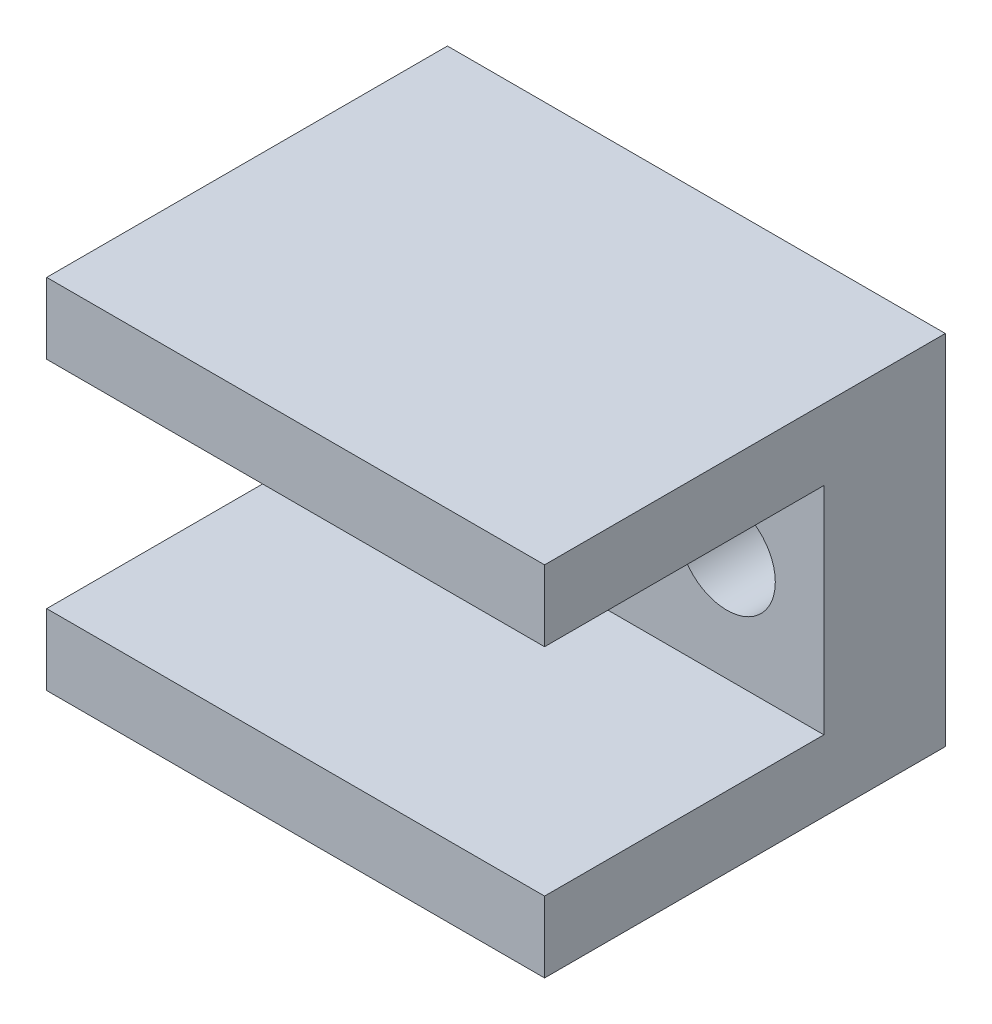
ISO-10303-21;
HEADER;
FILE_DESCRIPTION(('STEP AP214'),'2;1');
FILE_NAME('part.step','',(''),(''),'','','');
FILE_SCHEMA(('AUTOMOTIVE_DESIGN { 1 0 10303 214 1 1 1 1 }'));
ENDSEC;
DATA;
#1=APPLICATION_CONTEXT('core data for automotive mechanical design processes');
#2=APPLICATION_PROTOCOL_DEFINITION('international standard','automotive_design',2000,#1);
#3=PRODUCT_CONTEXT('',#1,'mechanical');
#4=PRODUCT('Part','Part','',(#3));
#5=PRODUCT_RELATED_PRODUCT_CATEGORY('part','',(#4));
#6=PRODUCT_DEFINITION_FORMATION('','',#4);
#7=PRODUCT_DEFINITION_CONTEXT('part definition',#1,'design');
#8=PRODUCT_DEFINITION('design','',#6,#7);
#9=PRODUCT_DEFINITION_SHAPE('','',#8);
#10=(LENGTH_UNIT() NAMED_UNIT(*) SI_UNIT(.MILLI.,.METRE.));
#11=(NAMED_UNIT(*) PLANE_ANGLE_UNIT() SI_UNIT($,.RADIAN.));
#12=(NAMED_UNIT(*) SI_UNIT($,.STERADIAN.) SOLID_ANGLE_UNIT());
#13=UNCERTAINTY_MEASURE_WITH_UNIT(LENGTH_MEASURE(1.E-05),#10,'distance_accuracy_value','');
#14=(GEOMETRIC_REPRESENTATION_CONTEXT(3) GLOBAL_UNCERTAINTY_ASSIGNED_CONTEXT((#13)) GLOBAL_UNIT_ASSIGNED_CONTEXT((#10,
#11,#12)) REPRESENTATION_CONTEXT('',''));
#15=CARTESIAN_POINT('',(0.,0.,0.));
#16=DIRECTION('',(0.,0.,1.));
#17=DIRECTION('',(1.,0.,0.));
#18=AXIS2_PLACEMENT_3D('',#15,#16,#17);
#19=CARTESIAN_POINT('',(0.,0.,10.));
#20=DIRECTION('',(0.,0.,-1.));
#21=DIRECTION('',(-1.,0.,0.));
#22=AXIS2_PLACEMENT_3D('',#19,#20,#21);
#23=PLANE('',#22);
#24=CARTESIAN_POINT('',(-12.5,0.,10.));
#25=DIRECTION('',(0.,0.,1.));
#26=DIRECTION('',(1.,0.,0.));
#27=AXIS2_PLACEMENT_3D('',#24,#25,#26);
#28=CIRCLE('',#27,4.);
#29=CARTESIAN_POINT('',(-8.5,0.,10.));
#30=VERTEX_POINT('',#29);
#31=EDGE_CURVE('E129',#30,#30,#28,.T.);
#32=ORIENTED_EDGE('',*,*,#31,.F.);
#33=EDGE_LOOP('',(#32));
#34=FACE_BOUND('',#33,.T.);
#35=CARTESIAN_POINT('',(12.5,0.,10.));
#36=DIRECTION('',(0.,0.,1.));
#37=DIRECTION('',(1.,0.,0.));
#38=AXIS2_PLACEMENT_3D('',#35,#36,#37);
#39=CIRCLE('',#38,4.);
#40=CARTESIAN_POINT('',(16.5,0.,10.));
#41=VERTEX_POINT('',#40);
#42=EDGE_CURVE('E342',#41,#41,#39,.T.);
#43=ORIENTED_EDGE('',*,*,#42,.F.);
#44=EDGE_LOOP('',(#43));
#45=FACE_BOUND('',#44,.T.);
#46=DIRECTION('',(-1.,0.,0.));
#47=VECTOR('',#46,1.);
#48=CARTESIAN_POINT('',(-20.5,-8.89,10.));
#49=LINE('',#48,#47);
#50=CARTESIAN_POINT('',(20.5,-8.89,10.));
#51=VERTEX_POINT('',#50);
#52=CARTESIAN_POINT('',(-20.5,-8.89,10.));
#53=VERTEX_POINT('',#52);
#54=EDGE_CURVE('E126',#51,#53,#49,.T.);
#55=ORIENTED_EDGE('',*,*,#54,.F.);
#56=DIRECTION('',(0.,1.,0.));
#57=VECTOR('',#56,1.);
#58=CARTESIAN_POINT('',(20.5,-14.732,10.));
#59=LINE('',#58,#57);
#60=CARTESIAN_POINT('',(20.5,8.89,10.));
#61=VERTEX_POINT('',#60);
#62=EDGE_CURVE('E174',#51,#61,#59,.T.);
#63=ORIENTED_EDGE('',*,*,#62,.T.);
#64=DIRECTION('',(1.,0.,0.));
#65=VECTOR('',#64,1.);
#66=CARTESIAN_POINT('',(-20.5,8.89,10.));
#67=LINE('',#66,#65);
#68=CARTESIAN_POINT('',(-20.5,8.89,10.));
#69=VERTEX_POINT('',#68);
#70=EDGE_CURVE('E146',#69,#61,#67,.T.);
#71=ORIENTED_EDGE('',*,*,#70,.F.);
#72=DIRECTION('',(0.,1.,0.));
#73=VECTOR('',#72,1.);
#74=CARTESIAN_POINT('',(-20.5,-14.732,10.));
#75=LINE('',#74,#73);
#76=EDGE_CURVE('E57',#53,#69,#75,.T.);
#77=ORIENTED_EDGE('',*,*,#76,.F.);
#78=EDGE_LOOP('',(#55,#63,#71,#77));
#79=FACE_BOUND('',#78,.T.);
#80=ADVANCED_FACE('F39',(#34,#45,#79),#23,.F.);
#81=CARTESIAN_POINT('',(-20.5,-14.732,10.));
#82=DIRECTION('',(-1.,0.,0.));
#83=DIRECTION('',(0.,0.,1.));
#84=AXIS2_PLACEMENT_3D('',#81,#82,#83);
#85=PLANE('',#84);
#86=DIRECTION('',(0.,1.,0.));
#87=VECTOR('',#86,1.);
#88=CARTESIAN_POINT('',(-20.5,-14.732,0.));
#89=LINE('',#88,#87);
#90=CARTESIAN_POINT('',(-20.5,-14.732,0.));
#91=VERTEX_POINT('',#90);
#92=CARTESIAN_POINT('',(-20.5,14.732,0.));
#93=VERTEX_POINT('',#92);
#94=EDGE_CURVE('E109',#91,#93,#89,.T.);
#95=ORIENTED_EDGE('',*,*,#94,.F.);
#96=DIRECTION('',(0.,0.,-1.));
#97=VECTOR('',#96,1.);
#98=CARTESIAN_POINT('',(-20.5,-14.732,10.));
#99=LINE('',#98,#97);
#100=CARTESIAN_POINT('',(-20.5,-14.732,33.));
#101=VERTEX_POINT('',#100);
#102=EDGE_CURVE('E11',#101,#91,#99,.T.);
#103=ORIENTED_EDGE('',*,*,#102,.F.);
#104=DIRECTION('',(0.,-1.,0.));
#105=VECTOR('',#104,1.);
#106=CARTESIAN_POINT('',(-20.5,-8.89,33.));
#107=LINE('',#106,#105);
#108=CARTESIAN_POINT('',(-20.5,-8.89,33.));
#109=VERTEX_POINT('',#108);
#110=EDGE_CURVE('E107',#109,#101,#107,.T.);
#111=ORIENTED_EDGE('',*,*,#110,.F.);
#112=DIRECTION('',(0.,0.,-1.));
#113=VECTOR('',#112,1.);
#114=CARTESIAN_POINT('',(-20.5,-8.89,33.));
#115=LINE('',#114,#113);
#116=EDGE_CURVE('E138',#109,#53,#115,.T.);
#117=ORIENTED_EDGE('',*,*,#116,.T.);
#118=ORIENTED_EDGE('',*,*,#76,.T.);
#119=DIRECTION('',(0.,0.,-1.));
#120=VECTOR('',#119,1.);
#121=CARTESIAN_POINT('',(-20.5,8.89,33.));
#122=LINE('',#121,#120);
#123=CARTESIAN_POINT('',(-20.5,8.89,33.));
#124=VERTEX_POINT('',#123);
#125=EDGE_CURVE('E168',#124,#69,#122,.T.);
#126=ORIENTED_EDGE('',*,*,#125,.F.);
#127=DIRECTION('',(0.,-1.,0.));
#128=VECTOR('',#127,1.);
#129=CARTESIAN_POINT('',(-20.5,8.89,33.));
#130=LINE('',#129,#128);
#131=CARTESIAN_POINT('',(-20.5,14.732,33.));
#132=VERTEX_POINT('',#131);
#133=EDGE_CURVE('E155',#132,#124,#130,.T.);
#134=ORIENTED_EDGE('',*,*,#133,.F.);
#135=DIRECTION('',(0.,0.,-1.));
#136=VECTOR('',#135,1.);
#137=CARTESIAN_POINT('',(-20.5,14.732,10.));
#138=LINE('',#137,#136);
#139=EDGE_CURVE('E43',#132,#93,#138,.T.);
#140=ORIENTED_EDGE('',*,*,#139,.T.);
#141=EDGE_LOOP('',(#95,#103,#111,#117,#118,#126,#134,#140));
#142=FACE_BOUND('',#141,.T.);
#143=ADVANCED_FACE('F41',(#142),#85,.T.);
#144=CARTESIAN_POINT('',(-20.5,-14.732,10.));
#145=DIRECTION('',(0.,1.,0.));
#146=DIRECTION('',(0.,0.,1.));
#147=AXIS2_PLACEMENT_3D('',#144,#145,#146);
#148=PLANE('',#147);
#149=DIRECTION('',(1.,0.,0.));
#150=VECTOR('',#149,1.);
#151=CARTESIAN_POINT('',(-20.5,-14.732,0.));
#152=LINE('',#151,#150);
#153=CARTESIAN_POINT('',(20.5,-14.732,0.));
#154=VERTEX_POINT('',#153);
#155=EDGE_CURVE('E175',#91,#154,#152,.T.);
#156=ORIENTED_EDGE('',*,*,#155,.T.);
#157=DIRECTION('',(0.,0.,-1.));
#158=VECTOR('',#157,1.);
#159=CARTESIAN_POINT('',(20.5,-14.732,10.));
#160=LINE('',#159,#158);
#161=CARTESIAN_POINT('',(20.5,-14.732,33.));
#162=VERTEX_POINT('',#161);
#163=EDGE_CURVE('E49',#162,#154,#160,.T.);
#164=ORIENTED_EDGE('',*,*,#163,.F.);
#165=DIRECTION('',(1.,0.,0.));
#166=VECTOR('',#165,1.);
#167=CARTESIAN_POINT('',(-20.5,-14.732,33.));
#168=LINE('',#167,#166);
#169=EDGE_CURVE('E113',#101,#162,#168,.T.);
#170=ORIENTED_EDGE('',*,*,#169,.F.);
#171=ORIENTED_EDGE('',*,*,#102,.T.);
#172=EDGE_LOOP('',(#156,#164,#170,#171));
#173=FACE_BOUND('',#172,.T.);
#174=ADVANCED_FACE('F114',(#173),#148,.F.);
#175=CARTESIAN_POINT('',(20.5,-14.732,10.));
#176=DIRECTION('',(-1.,0.,0.));
#177=DIRECTION('',(0.,0.,1.));
#178=AXIS2_PLACEMENT_3D('',#175,#176,#177);
#179=PLANE('',#178);
#180=DIRECTION('',(0.,1.,0.));
#181=VECTOR('',#180,1.);
#182=CARTESIAN_POINT('',(20.5,-14.732,0.));
#183=LINE('',#182,#181);
#184=CARTESIAN_POINT('',(20.5,14.732,0.));
#185=VERTEX_POINT('',#184);
#186=EDGE_CURVE('E184',#154,#185,#183,.T.);
#187=ORIENTED_EDGE('',*,*,#186,.T.);
#188=DIRECTION('',(0.,0.,-1.));
#189=VECTOR('',#188,1.);
#190=CARTESIAN_POINT('',(20.5,14.732,10.));
#191=LINE('',#190,#189);
#192=CARTESIAN_POINT('',(20.5,14.732,33.));
#193=VERTEX_POINT('',#192);
#194=EDGE_CURVE('E191',#193,#185,#191,.T.);
#195=ORIENTED_EDGE('',*,*,#194,.F.);
#196=DIRECTION('',(0.,1.,0.));
#197=VECTOR('',#196,1.);
#198=CARTESIAN_POINT('',(20.5,8.89,33.));
#199=LINE('',#198,#197);
#200=CARTESIAN_POINT('',(20.5,8.89,33.));
#201=VERTEX_POINT('',#200);
#202=EDGE_CURVE('E147',#201,#193,#199,.T.);
#203=ORIENTED_EDGE('',*,*,#202,.F.);
#204=DIRECTION('',(0.,0.,-1.));
#205=VECTOR('',#204,1.);
#206=CARTESIAN_POINT('',(20.5,8.89,33.));
#207=LINE('',#206,#205);
#208=EDGE_CURVE('E161',#201,#61,#207,.T.);
#209=ORIENTED_EDGE('',*,*,#208,.T.);
#210=ORIENTED_EDGE('',*,*,#62,.F.);
#211=DIRECTION('',(0.,0.,-1.));
#212=VECTOR('',#211,1.);
#213=CARTESIAN_POINT('',(20.5,-8.89,33.));
#214=LINE('',#213,#212);
#215=CARTESIAN_POINT('',(20.5,-8.89,33.));
#216=VERTEX_POINT('',#215);
#217=EDGE_CURVE('E142',#216,#51,#214,.T.);
#218=ORIENTED_EDGE('',*,*,#217,.F.);
#219=DIRECTION('',(0.,1.,0.));
#220=VECTOR('',#219,1.);
#221=CARTESIAN_POINT('',(20.5,-8.89,33.));
#222=LINE('',#221,#220);
#223=EDGE_CURVE('E119',#162,#216,#222,.T.);
#224=ORIENTED_EDGE('',*,*,#223,.F.);
#225=ORIENTED_EDGE('',*,*,#163,.T.);
#226=EDGE_LOOP('',(#187,#195,#203,#209,#210,#218,#224,#225));
#227=FACE_BOUND('',#226,.T.);
#228=ADVANCED_FACE('F203',(#227),#179,.F.);
#229=CARTESIAN_POINT('',(-20.5,14.732,10.));
#230=DIRECTION('',(0.,1.,0.));
#231=DIRECTION('',(0.,0.,1.));
#232=AXIS2_PLACEMENT_3D('',#229,#230,#231);
#233=PLANE('',#232);
#234=DIRECTION('',(1.,0.,0.));
#235=VECTOR('',#234,1.);
#236=CARTESIAN_POINT('',(-20.5,14.732,0.));
#237=LINE('',#236,#235);
#238=EDGE_CURVE('E180',#93,#185,#237,.T.);
#239=ORIENTED_EDGE('',*,*,#238,.F.);
#240=ORIENTED_EDGE('',*,*,#139,.F.);
#241=DIRECTION('',(-1.,0.,0.));
#242=VECTOR('',#241,1.);
#243=CARTESIAN_POINT('',(-20.5,14.732,33.));
#244=LINE('',#243,#242);
#245=EDGE_CURVE('E151',#193,#132,#244,.T.);
#246=ORIENTED_EDGE('',*,*,#245,.F.);
#247=ORIENTED_EDGE('',*,*,#194,.T.);
#248=EDGE_LOOP('',(#239,#240,#246,#247));
#249=FACE_BOUND('',#248,.T.);
#250=ADVANCED_FACE('F198',(#249),#233,.T.);
#251=CARTESIAN_POINT('',(0.,0.,0.));
#252=DIRECTION('',(0.,0.,-1.));
#253=DIRECTION('',(-1.,0.,0.));
#254=AXIS2_PLACEMENT_3D('',#251,#252,#253);
#255=PLANE('',#254);
#256=CARTESIAN_POINT('',(-12.5,0.,0.));
#257=DIRECTION('',(0.,0.,-1.));
#258=DIRECTION('',(-1.,0.,0.));
#259=AXIS2_PLACEMENT_3D('',#256,#257,#258);
#260=CIRCLE('',#259,4.);
#261=CARTESIAN_POINT('',(-16.5,0.,0.));
#262=VERTEX_POINT('',#261);
#263=EDGE_CURVE('E337',#262,#262,#260,.F.);
#264=ORIENTED_EDGE('',*,*,#263,.T.);
#265=EDGE_LOOP('',(#264));
#266=FACE_BOUND('',#265,.T.);
#267=CARTESIAN_POINT('',(12.5,0.,0.));
#268=DIRECTION('',(0.,0.,-1.));
#269=DIRECTION('',(-1.,0.,0.));
#270=AXIS2_PLACEMENT_3D('',#267,#268,#269);
#271=CIRCLE('',#270,4.);
#272=CARTESIAN_POINT('',(8.5,0.,0.));
#273=VERTEX_POINT('',#272);
#274=EDGE_CURVE('E132',#273,#273,#271,.F.);
#275=ORIENTED_EDGE('',*,*,#274,.T.);
#276=EDGE_LOOP('',(#275));
#277=FACE_BOUND('',#276,.T.);
#278=ORIENTED_EDGE('',*,*,#94,.T.);
#279=ORIENTED_EDGE('',*,*,#238,.T.);
#280=ORIENTED_EDGE('',*,*,#186,.F.);
#281=ORIENTED_EDGE('',*,*,#155,.F.);
#282=EDGE_LOOP('',(#278,#279,#280,#281));
#283=FACE_BOUND('',#282,.T.);
#284=ADVANCED_FACE('F201',(#266,#277,#283),#255,.T.);
#285=CARTESIAN_POINT('',(-20.5,8.89,33.));
#286=DIRECTION('',(0.,1.,0.));
#287=DIRECTION('',(0.,0.,1.));
#288=AXIS2_PLACEMENT_3D('',#285,#286,#287);
#289=PLANE('',#288);
#290=ORIENTED_EDGE('',*,*,#70,.T.);
#291=ORIENTED_EDGE('',*,*,#208,.F.);
#292=DIRECTION('',(1.,0.,0.));
#293=VECTOR('',#292,1.);
#294=CARTESIAN_POINT('',(-20.5,8.89,33.));
#295=LINE('',#294,#293);
#296=EDGE_CURVE('E158',#124,#201,#295,.T.);
#297=ORIENTED_EDGE('',*,*,#296,.F.);
#298=ORIENTED_EDGE('',*,*,#125,.T.);
#299=EDGE_LOOP('',(#290,#291,#297,#298));
#300=FACE_BOUND('',#299,.T.);
#301=ADVANCED_FACE('F209',(#300),#289,.F.);
#302=CARTESIAN_POINT('',(0.,0.,33.));
#303=DIRECTION('',(0.,0.,-1.));
#304=DIRECTION('',(-1.,0.,0.));
#305=AXIS2_PLACEMENT_3D('',#302,#303,#304);
#306=PLANE('',#305);
#307=ORIENTED_EDGE('',*,*,#202,.T.);
#308=ORIENTED_EDGE('',*,*,#245,.T.);
#309=ORIENTED_EDGE('',*,*,#133,.T.);
#310=ORIENTED_EDGE('',*,*,#296,.T.);
#311=EDGE_LOOP('',(#307,#308,#309,#310));
#312=FACE_BOUND('',#311,.T.);
#313=ADVANCED_FACE('F213',(#312),#306,.F.);
#314=CARTESIAN_POINT('',(-20.5,-8.89,33.));
#315=DIRECTION('',(0.,-1.,0.));
#316=DIRECTION('',(0.,0.,-1.));
#317=AXIS2_PLACEMENT_3D('',#314,#315,#316);
#318=PLANE('',#317);
#319=ORIENTED_EDGE('',*,*,#54,.T.);
#320=ORIENTED_EDGE('',*,*,#116,.F.);
#321=DIRECTION('',(-1.,0.,0.));
#322=VECTOR('',#321,1.);
#323=CARTESIAN_POINT('',(-20.5,-8.89,33.));
#324=LINE('',#323,#322);
#325=EDGE_CURVE('E123',#216,#109,#324,.T.);
#326=ORIENTED_EDGE('',*,*,#325,.F.);
#327=ORIENTED_EDGE('',*,*,#217,.T.);
#328=EDGE_LOOP('',(#319,#320,#326,#327));
#329=FACE_BOUND('',#328,.T.);
#330=ADVANCED_FACE('F206',(#329),#318,.F.);
#331=CARTESIAN_POINT('',(0.,0.,33.));
#332=DIRECTION('',(0.,0.,1.));
#333=DIRECTION('',(1.,0.,0.));
#334=AXIS2_PLACEMENT_3D('',#331,#332,#333);
#335=PLANE('',#334);
#336=ORIENTED_EDGE('',*,*,#110,.T.);
#337=ORIENTED_EDGE('',*,*,#169,.T.);
#338=ORIENTED_EDGE('',*,*,#223,.T.);
#339=ORIENTED_EDGE('',*,*,#325,.T.);
#340=EDGE_LOOP('',(#336,#337,#338,#339));
#341=FACE_BOUND('',#340,.T.);
#342=ADVANCED_FACE('F121',(#341),#335,.T.);
#343=CARTESIAN_POINT('',(12.5,0.,-0.000999999999999265));
#344=DIRECTION('',(0.,0.,1.));
#345=DIRECTION('',(1.,0.,0.));
#346=AXIS2_PLACEMENT_3D('',#343,#344,#345);
#347=CYLINDRICAL_SURFACE('',#346,4.);
#348=ORIENTED_EDGE('',*,*,#274,.F.);
#349=EDGE_LOOP('',(#348));
#350=FACE_BOUND('',#349,.T.);
#351=ORIENTED_EDGE('',*,*,#42,.T.);
#352=EDGE_LOOP('',(#351));
#353=FACE_BOUND('',#352,.T.);
#354=ADVANCED_FACE('F269',(#350,#353),#347,.F.);
#355=CARTESIAN_POINT('',(-12.5,0.,-0.000999999999999265));
#356=DIRECTION('',(0.,0.,1.));
#357=DIRECTION('',(1.,0.,0.));
#358=AXIS2_PLACEMENT_3D('',#355,#356,#357);
#359=CYLINDRICAL_SURFACE('',#358,4.);
#360=ORIENTED_EDGE('',*,*,#263,.F.);
#361=EDGE_LOOP('',(#360));
#362=FACE_BOUND('',#361,.T.);
#363=ORIENTED_EDGE('',*,*,#31,.T.);
#364=EDGE_LOOP('',(#363));
#365=FACE_BOUND('',#364,.T.);
#366=ADVANCED_FACE('F320',(#362,#365),#359,.F.);
#367=CLOSED_SHELL('',(#80,#143,#174,#228,#250,#284,#301,#313,#330,#342,#354,#366));
#368=MANIFOLD_SOLID_BREP('B2',#367);
#369=ADVANCED_BREP_SHAPE_REPRESENTATION('',(#18,#368),#14);
#370=SHAPE_DEFINITION_REPRESENTATION(#9,#369);
ENDSEC;
END-ISO-10303-21;
